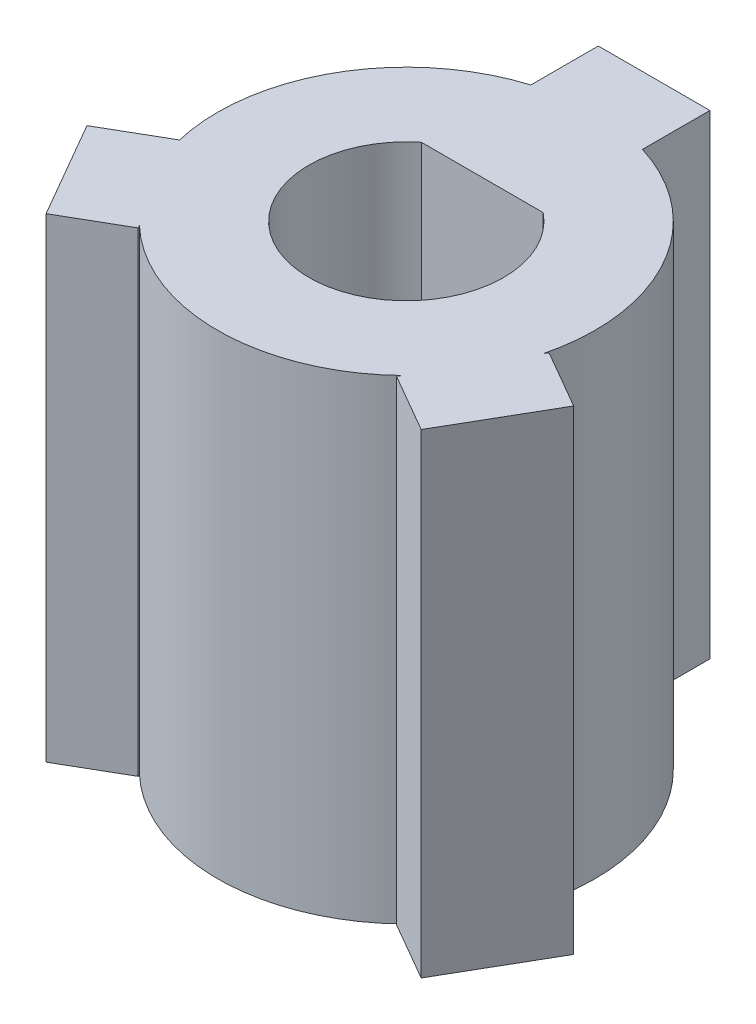
ISO-10303-21;
HEADER;
FILE_DESCRIPTION(('STEP AP214'),'2;1');
FILE_NAME('part.step','',(''),(''),'','','');
FILE_SCHEMA(('AUTOMOTIVE_DESIGN { 1 0 10303 214 1 1 1 1 }'));
ENDSEC;
DATA;
#1=APPLICATION_CONTEXT('core data for automotive mechanical design processes');
#2=APPLICATION_PROTOCOL_DEFINITION('international standard','automotive_design',2000,#1);
#3=PRODUCT_CONTEXT('',#1,'mechanical');
#4=PRODUCT('Part','Part','',(#3));
#5=PRODUCT_RELATED_PRODUCT_CATEGORY('part','',(#4));
#6=PRODUCT_DEFINITION_FORMATION('','',#4);
#7=PRODUCT_DEFINITION_CONTEXT('part definition',#1,'design');
#8=PRODUCT_DEFINITION('design','',#6,#7);
#9=PRODUCT_DEFINITION_SHAPE('','',#8);
#10=(LENGTH_UNIT() NAMED_UNIT(*) SI_UNIT(.MILLI.,.METRE.));
#11=(NAMED_UNIT(*) PLANE_ANGLE_UNIT() SI_UNIT($,.RADIAN.));
#12=(NAMED_UNIT(*) SI_UNIT($,.STERADIAN.) SOLID_ANGLE_UNIT());
#13=UNCERTAINTY_MEASURE_WITH_UNIT(LENGTH_MEASURE(1.E-05),#10,'distance_accuracy_value','');
#14=(GEOMETRIC_REPRESENTATION_CONTEXT(3) GLOBAL_UNCERTAINTY_ASSIGNED_CONTEXT((#13)) GLOBAL_UNIT_ASSIGNED_CONTEXT((#10,
#11,#12)) REPRESENTATION_CONTEXT('',''));
#15=CARTESIAN_POINT('',(0.,0.,0.));
#16=DIRECTION('',(0.,0.,1.));
#17=DIRECTION('',(1.,0.,0.));
#18=AXIS2_PLACEMENT_3D('',#15,#16,#17);
#19=CARTESIAN_POINT('',(0.,10.,0.));
#20=DIRECTION('',(0.,-1.,0.));
#21=DIRECTION('',(0.,0.,-1.));
#22=AXIS2_PLACEMENT_3D('',#19,#20,#21);
#23=CYLINDRICAL_SURFACE('',#22,3.975);
#24=CARTESIAN_POINT('',(0.,10.,0.));
#25=DIRECTION('',(0.,1.,0.));
#26=DIRECTION('',(0.,0.,1.));
#27=AXIS2_PLACEMENT_3D('',#24,#25,#26);
#28=CIRCLE('',#27,3.975);
#29=CARTESIAN_POINT('',(-2.73416765693012,10.,2.88529933001713));
#30=VERTEX_POINT('',#29);
#31=CARTESIAN_POINT('',(2.76816174994799,10.,2.85270144356624));
#32=VERTEX_POINT('',#31);
#33=EDGE_CURVE('E49',#30,#32,#28,.T.);
#34=ORIENTED_EDGE('',*,*,#33,.F.);
#35=DIRECTION('',(0.,-1.,0.));
#36=VECTOR('',#35,1.);
#37=CARTESIAN_POINT('',(-2.73416765693011,10.,2.88529933001713));
#38=LINE('',#37,#36);
#39=CARTESIAN_POINT('',(-2.73416765693012,0.,2.88529933001713));
#40=VERTEX_POINT('',#39);
#41=EDGE_CURVE('E229',#30,#40,#38,.T.);
#42=ORIENTED_EDGE('',*,*,#41,.T.);
#43=CARTESIAN_POINT('',(0.,0.,0.));
#44=DIRECTION('',(0.,1.,0.));
#45=DIRECTION('',(0.,0.,1.));
#46=AXIS2_PLACEMENT_3D('',#43,#44,#45);
#47=CIRCLE('',#46,3.975);
#48=CARTESIAN_POINT('',(2.76816174994799,0.,2.85270144356624));
#49=VERTEX_POINT('',#48);
#50=EDGE_CURVE('E376',#40,#49,#47,.T.);
#51=ORIENTED_EDGE('',*,*,#50,.T.);
#52=DIRECTION('',(0.,-1.,0.));
#53=VECTOR('',#52,1.);
#54=CARTESIAN_POINT('',(2.76816174994798,10.,2.85270144356624));
#55=LINE('',#54,#53);
#56=EDGE_CURVE('E267',#49,#32,#55,.F.);
#57=ORIENTED_EDGE('',*,*,#56,.T.);
#58=EDGE_LOOP('',(#34,#42,#51,#57));
#59=FACE_BOUND('',#58,.T.);
#60=ADVANCED_FACE('F39',(#59),#23,.T.);
#61=CARTESIAN_POINT('',(3.8545927945149,10.,0.970947675456227));
#62=VERTEX_POINT('',#61);
#63=CARTESIAN_POINT('',(1.175,10.,-3.79736750920951));
#64=VERTEX_POINT('',#63);
#65=EDGE_CURVE('E50',#62,#64,#28,.T.);
#66=ORIENTED_EDGE('',*,*,#65,.F.);
#67=DIRECTION('',(0.,-1.,0.));
#68=VECTOR('',#67,1.);
#69=CARTESIAN_POINT('',(3.8545927945149,10.,0.970947675456223));
#70=LINE('',#69,#68);
#71=CARTESIAN_POINT('',(3.8545927945149,0.,0.970947675456226));
#72=VERTEX_POINT('',#71);
#73=EDGE_CURVE('E280',#62,#72,#70,.T.);
#74=ORIENTED_EDGE('',*,*,#73,.T.);
#75=CARTESIAN_POINT('',(1.175,0.,-3.79736750920951));
#76=VERTEX_POINT('',#75);
#77=EDGE_CURVE('E339',#72,#76,#47,.T.);
#78=ORIENTED_EDGE('',*,*,#77,.T.);
#79=DIRECTION('',(0.,1.,0.));
#80=VECTOR('',#79,1.);
#81=CARTESIAN_POINT('',(1.175,0.,-3.79736750920951));
#82=LINE('',#81,#80);
#83=EDGE_CURVE('E314',#76,#64,#82,.T.);
#84=ORIENTED_EDGE('',*,*,#83,.T.);
#85=EDGE_LOOP('',(#66,#74,#78,#84));
#86=FACE_BOUND('',#85,.T.);
#87=ADVANCED_FACE('F361',(#86),#23,.T.);
#88=CARTESIAN_POINT('',(-1.175,0.,-3.79736750920951));
#89=VERTEX_POINT('',#88);
#90=CARTESIAN_POINT('',(-3.86582634578211,0.,0.925208984098694));
#91=VERTEX_POINT('',#90);
#92=EDGE_CURVE('E43',#89,#91,#47,.T.);
#93=ORIENTED_EDGE('',*,*,#92,.T.);
#94=DIRECTION('',(0.,-1.,0.));
#95=VECTOR('',#94,1.);
#96=CARTESIAN_POINT('',(-3.86582634578211,10.,0.925208984098691));
#97=LINE('',#96,#95);
#98=CARTESIAN_POINT('',(-3.86582634578211,10.,0.925208984098694));
#99=VERTEX_POINT('',#98);
#100=EDGE_CURVE('E174',#91,#99,#97,.F.);
#101=ORIENTED_EDGE('',*,*,#100,.T.);
#102=CARTESIAN_POINT('',(-1.175,10.,-3.79736750920951));
#103=VERTEX_POINT('',#102);
#104=EDGE_CURVE('E11',#103,#99,#28,.T.);
#105=ORIENTED_EDGE('',*,*,#104,.F.);
#106=DIRECTION('',(0.,1.,0.));
#107=VECTOR('',#106,1.);
#108=CARTESIAN_POINT('',(-1.175,0.,-3.79736750920951));
#109=LINE('',#108,#107);
#110=EDGE_CURVE('E297',#89,#103,#109,.T.);
#111=ORIENTED_EDGE('',*,*,#110,.F.);
#112=EDGE_LOOP('',(#93,#101,#105,#111));
#113=FACE_BOUND('',#112,.T.);
#114=ADVANCED_FACE('F41',(#113),#23,.T.);
#115=CARTESIAN_POINT('',(0.,10.,0.));
#116=DIRECTION('',(0.,1.,0.));
#117=DIRECTION('',(0.,0.,1.));
#118=AXIS2_PLACEMENT_3D('',#115,#116,#117);
#119=PLANE('',#118);
#120=ORIENTED_EDGE('',*,*,#104,.T.);
#121=DIRECTION('',(-0.5,0.,-0.866025403784438));
#122=VECTOR('',#121,1.);
#123=CARTESIAN_POINT('',(-2.70111673048088,10.,2.94254521386443));
#124=LINE('',#123,#122);
#125=CARTESIAN_POINT('',(-3.87611673048088,10.,0.907385514970996));
#126=VERTEX_POINT('',#125);
#127=EDGE_CURVE('E210',#99,#126,#124,.T.);
#128=ORIENTED_EDGE('',*,*,#127,.T.);
#129=DIRECTION('',(-0.866025403784438,0.,0.500000000000001));
#130=VECTOR('',#129,1.);
#131=CARTESIAN_POINT('',(-3.87611673048088,10.,0.907385514970996));
#132=LINE('',#131,#130);
#133=CARTESIAN_POINT('',(-5.10587280385478,10.,1.617385514971));
#134=VERTEX_POINT('',#133);
#135=EDGE_CURVE('E188',#126,#134,#132,.T.);
#136=ORIENTED_EDGE('',*,*,#135,.T.);
#137=DIRECTION('',(0.5,0.,0.866025403784438));
#138=VECTOR('',#137,1.);
#139=CARTESIAN_POINT('',(-5.10587280385478,10.,1.617385514971));
#140=LINE('',#139,#138);
#141=CARTESIAN_POINT('',(-3.93087280385478,10.,3.65254521386443));
#142=VERTEX_POINT('',#141);
#143=EDGE_CURVE('E213',#134,#142,#140,.T.);
#144=ORIENTED_EDGE('',*,*,#143,.T.);
#145=DIRECTION('',(0.866025403784439,0.,-0.5));
#146=VECTOR('',#145,1.);
#147=CARTESIAN_POINT('',(-3.93087280385478,10.,3.65254521386443));
#148=LINE('',#147,#146);
#149=CARTESIAN_POINT('',(-2.70111673048088,10.,2.94254521386443));
#150=VERTEX_POINT('',#149);
#151=EDGE_CURVE('E181',#142,#150,#148,.T.);
#152=ORIENTED_EDGE('',*,*,#151,.T.);
#153=EDGE_CURVE('E57',#150,#30,#124,.T.);
#154=ORIENTED_EDGE('',*,*,#153,.T.);
#155=ORIENTED_EDGE('',*,*,#33,.T.);
#156=DIRECTION('',(-0.5,0.,0.866025403784439));
#157=VECTOR('',#156,1.);
#158=CARTESIAN_POINT('',(3.89887727223154,10.,0.89424471006435));
#159=LINE('',#158,#157);
#160=CARTESIAN_POINT('',(2.72387727223154,10.,2.92940440895778));
#161=VERTEX_POINT('',#160);
#162=EDGE_CURVE('E233',#32,#161,#159,.T.);
#163=ORIENTED_EDGE('',*,*,#162,.T.);
#164=DIRECTION('',(0.866025403784439,0.,0.5));
#165=VECTOR('',#164,1.);
#166=CARTESIAN_POINT('',(2.72387727223154,10.,2.92940440895778));
#167=LINE('',#166,#165);
#168=CARTESIAN_POINT('',(3.95363334560544,10.,3.63940440895778));
#169=VERTEX_POINT('',#168);
#170=EDGE_CURVE('E253',#161,#169,#167,.T.);
#171=ORIENTED_EDGE('',*,*,#170,.T.);
#172=DIRECTION('',(0.499999999999999,0.,-0.866025403784439));
#173=VECTOR('',#172,1.);
#174=CARTESIAN_POINT('',(3.95363334560544,10.,3.63940440895778));
#175=LINE('',#174,#173);
#176=CARTESIAN_POINT('',(5.12863334560544,10.,1.60424471006435));
#177=VERTEX_POINT('',#176);
#178=EDGE_CURVE('E257',#169,#177,#175,.T.);
#179=ORIENTED_EDGE('',*,*,#178,.T.);
#180=DIRECTION('',(-0.866025403784439,0.,-0.5));
#181=VECTOR('',#180,1.);
#182=CARTESIAN_POINT('',(5.12863334560544,10.,1.60424471006435));
#183=LINE('',#182,#181);
#184=CARTESIAN_POINT('',(3.89887727223154,10.,0.89424471006435));
#185=VERTEX_POINT('',#184);
#186=EDGE_CURVE('E261',#177,#185,#183,.T.);
#187=ORIENTED_EDGE('',*,*,#186,.T.);
#188=EDGE_CURVE('E64',#185,#62,#159,.T.);
#189=ORIENTED_EDGE('',*,*,#188,.T.);
#190=ORIENTED_EDGE('',*,*,#65,.T.);
#191=DIRECTION('',(0.,0.,-1.));
#192=VECTOR('',#191,1.);
#193=CARTESIAN_POINT('',(1.175,10.,-3.79736750920951));
#194=LINE('',#193,#192);
#195=CARTESIAN_POINT('',(1.175,10.,-5.21736750920951));
#196=VERTEX_POINT('',#195);
#197=EDGE_CURVE('E300',#64,#196,#194,.T.);
#198=ORIENTED_EDGE('',*,*,#197,.T.);
#199=DIRECTION('',(-1.,0.,0.));
#200=VECTOR('',#199,1.);
#201=CARTESIAN_POINT('',(1.175,10.,-5.21736750920951));
#202=LINE('',#201,#200);
#203=CARTESIAN_POINT('',(-1.175,10.,-5.21736750920951));
#204=VERTEX_POINT('',#203);
#205=EDGE_CURVE('E289',#196,#204,#202,.T.);
#206=ORIENTED_EDGE('',*,*,#205,.T.);
#207=DIRECTION('',(0.,0.,1.));
#208=VECTOR('',#207,1.);
#209=CARTESIAN_POINT('',(-1.175,10.,-5.21736750920951));
#210=LINE('',#209,#208);
#211=EDGE_CURVE('E284',#204,#103,#210,.T.);
#212=ORIENTED_EDGE('',*,*,#211,.T.);
#213=EDGE_LOOP('',(#120,#128,#136,#144,#152,#154,#155,#163,#171,#179,#187,#189,#190,#198,#206,#212));
#214=FACE_BOUND('',#213,.T.);
#215=CARTESIAN_POINT('',(0.,10.,0.));
#216=DIRECTION('',(0.,1.,0.));
#217=DIRECTION('',(0.,0.,1.));
#218=AXIS2_PLACEMENT_3D('',#215,#216,#217);
#219=CIRCLE('',#218,2.05);
#220=CARTESIAN_POINT('',(-1.28160056179763,10.,-1.6));
#221=VERTEX_POINT('',#220);
#222=CARTESIAN_POINT('',(1.28160056179763,10.,-1.6));
#223=VERTEX_POINT('',#222);
#224=EDGE_CURVE('E310',#221,#223,#219,.T.);
#225=ORIENTED_EDGE('',*,*,#224,.F.);
#226=DIRECTION('',(-1.,0.,0.));
#227=VECTOR('',#226,1.);
#228=CARTESIAN_POINT('',(-1.28160056179763,10.,-1.6));
#229=LINE('',#228,#227);
#230=EDGE_CURVE('E326',#223,#221,#229,.T.);
#231=ORIENTED_EDGE('',*,*,#230,.F.);
#232=EDGE_LOOP('',(#225,#231));
#233=FACE_BOUND('',#232,.T.);
#234=ADVANCED_FACE('F350',(#214,#233),#119,.T.);
#235=CARTESIAN_POINT('',(0.,0.,0.));
#236=DIRECTION('',(0.,1.,0.));
#237=DIRECTION('',(0.,0.,1.));
#238=AXIS2_PLACEMENT_3D('',#235,#236,#237);
#239=PLANE('',#238);
#240=DIRECTION('',(-1.,0.,0.));
#241=VECTOR('',#240,1.);
#242=CARTESIAN_POINT('',(-1.28160056179763,0.,-1.6));
#243=LINE('',#242,#241);
#244=CARTESIAN_POINT('',(1.28160056179763,0.,-1.6));
#245=VERTEX_POINT('',#244);
#246=CARTESIAN_POINT('',(-1.28160056179763,0.,-1.6));
#247=VERTEX_POINT('',#246);
#248=EDGE_CURVE('E325',#245,#247,#243,.T.);
#249=ORIENTED_EDGE('',*,*,#248,.T.);
#250=CARTESIAN_POINT('',(0.,0.,0.));
#251=DIRECTION('',(0.,1.,0.));
#252=DIRECTION('',(0.,0.,1.));
#253=AXIS2_PLACEMENT_3D('',#250,#251,#252);
#254=CIRCLE('',#253,2.05);
#255=EDGE_CURVE('E321',#247,#245,#254,.T.);
#256=ORIENTED_EDGE('',*,*,#255,.T.);
#257=EDGE_LOOP('',(#249,#256));
#258=FACE_BOUND('',#257,.T.);
#259=ORIENTED_EDGE('',*,*,#50,.F.);
#260=DIRECTION('',(-0.5,0.,-0.866025403784438));
#261=VECTOR('',#260,1.);
#262=CARTESIAN_POINT('',(-2.70111673048088,0.,2.94254521386443));
#263=LINE('',#262,#261);
#264=CARTESIAN_POINT('',(-2.70111673048088,0.,2.94254521386443));
#265=VERTEX_POINT('',#264);
#266=EDGE_CURVE('E180',#265,#40,#263,.T.);
#267=ORIENTED_EDGE('',*,*,#266,.F.);
#268=DIRECTION('',(0.866025403784439,0.,-0.5));
#269=VECTOR('',#268,1.);
#270=CARTESIAN_POINT('',(-3.93087280385478,0.,3.65254521386443));
#271=LINE('',#270,#269);
#272=CARTESIAN_POINT('',(-3.93087280385478,0.,3.65254521386443));
#273=VERTEX_POINT('',#272);
#274=EDGE_CURVE('E191',#273,#265,#271,.T.);
#275=ORIENTED_EDGE('',*,*,#274,.F.);
#276=DIRECTION('',(0.5,0.,0.866025403784438));
#277=VECTOR('',#276,1.);
#278=CARTESIAN_POINT('',(-5.10587280385478,0.,1.617385514971));
#279=LINE('',#278,#277);
#280=CARTESIAN_POINT('',(-5.10587280385478,0.,1.617385514971));
#281=VERTEX_POINT('',#280);
#282=EDGE_CURVE('E198',#281,#273,#279,.T.);
#283=ORIENTED_EDGE('',*,*,#282,.F.);
#284=DIRECTION('',(-0.866025403784438,0.,0.500000000000001));
#285=VECTOR('',#284,1.);
#286=CARTESIAN_POINT('',(-3.87611673048088,0.,0.907385514970996));
#287=LINE('',#286,#285);
#288=CARTESIAN_POINT('',(-3.87611673048088,0.,0.907385514970996));
#289=VERTEX_POINT('',#288);
#290=EDGE_CURVE('E186',#289,#281,#287,.T.);
#291=ORIENTED_EDGE('',*,*,#290,.F.);
#292=EDGE_CURVE('E168',#91,#289,#263,.T.);
#293=ORIENTED_EDGE('',*,*,#292,.F.);
#294=ORIENTED_EDGE('',*,*,#92,.F.);
#295=DIRECTION('',(0.,0.,1.));
#296=VECTOR('',#295,1.);
#297=CARTESIAN_POINT('',(-1.175,0.,-5.21736750920951));
#298=LINE('',#297,#296);
#299=CARTESIAN_POINT('',(-1.175,0.,-5.21736750920951));
#300=VERTEX_POINT('',#299);
#301=EDGE_CURVE('E285',#300,#89,#298,.T.);
#302=ORIENTED_EDGE('',*,*,#301,.F.);
#303=DIRECTION('',(-1.,0.,0.));
#304=VECTOR('',#303,1.);
#305=CARTESIAN_POINT('',(1.175,0.,-5.21736750920951));
#306=LINE('',#305,#304);
#307=CARTESIAN_POINT('',(1.175,0.,-5.21736750920951));
#308=VERTEX_POINT('',#307);
#309=EDGE_CURVE('E293',#308,#300,#306,.T.);
#310=ORIENTED_EDGE('',*,*,#309,.F.);
#311=DIRECTION('',(0.,0.,-1.));
#312=VECTOR('',#311,1.);
#313=CARTESIAN_POINT('',(1.175,0.,-3.79736750920951));
#314=LINE('',#313,#312);
#315=EDGE_CURVE('E288',#76,#308,#314,.T.);
#316=ORIENTED_EDGE('',*,*,#315,.F.);
#317=ORIENTED_EDGE('',*,*,#77,.F.);
#318=DIRECTION('',(-0.5,0.,0.866025403784439));
#319=VECTOR('',#318,1.);
#320=CARTESIAN_POINT('',(3.89887727223154,0.,0.89424471006435));
#321=LINE('',#320,#319);
#322=CARTESIAN_POINT('',(3.89887727223154,0.,0.89424471006435));
#323=VERTEX_POINT('',#322);
#324=EDGE_CURVE('E234',#323,#72,#321,.T.);
#325=ORIENTED_EDGE('',*,*,#324,.F.);
#326=DIRECTION('',(-0.866025403784439,0.,-0.5));
#327=VECTOR('',#326,1.);
#328=CARTESIAN_POINT('',(5.12863334560544,0.,1.60424471006435));
#329=LINE('',#328,#327);
#330=CARTESIAN_POINT('',(5.12863334560544,0.,1.60424471006435));
#331=VERTEX_POINT('',#330);
#332=EDGE_CURVE('E246',#331,#323,#329,.T.);
#333=ORIENTED_EDGE('',*,*,#332,.F.);
#334=DIRECTION('',(0.499999999999999,0.,-0.866025403784439));
#335=VECTOR('',#334,1.);
#336=CARTESIAN_POINT('',(3.95363334560544,0.,3.63940440895778));
#337=LINE('',#336,#335);
#338=CARTESIAN_POINT('',(3.95363334560544,0.,3.63940440895778));
#339=VERTEX_POINT('',#338);
#340=EDGE_CURVE('E242',#339,#331,#337,.T.);
#341=ORIENTED_EDGE('',*,*,#340,.F.);
#342=DIRECTION('',(0.866025403784439,0.,0.5));
#343=VECTOR('',#342,1.);
#344=CARTESIAN_POINT('',(2.72387727223154,0.,2.92940440895778));
#345=LINE('',#344,#343);
#346=CARTESIAN_POINT('',(2.72387727223154,0.,2.92940440895778));
#347=VERTEX_POINT('',#346);
#348=EDGE_CURVE('E237',#347,#339,#345,.T.);
#349=ORIENTED_EDGE('',*,*,#348,.F.);
#350=EDGE_CURVE('E238',#49,#347,#321,.T.);
#351=ORIENTED_EDGE('',*,*,#350,.F.);
#352=EDGE_LOOP('',(#259,#267,#275,#283,#291,#293,#294,#302,#310,#316,#317,#325,#333,#341,#349,#351));
#353=FACE_BOUND('',#352,.T.);
#354=ADVANCED_FACE('F195',(#258,#353),#239,.F.);
#355=CARTESIAN_POINT('',(0.,0.,0.));
#356=DIRECTION('',(0.,1.,0.));
#357=DIRECTION('',(0.,0.,1.));
#358=AXIS2_PLACEMENT_3D('',#355,#356,#357);
#359=CYLINDRICAL_SURFACE('',#358,2.05);
#360=ORIENTED_EDGE('',*,*,#224,.T.);
#361=DIRECTION('',(0.,1.,0.));
#362=VECTOR('',#361,1.);
#363=CARTESIAN_POINT('',(1.28160056179763,0.,-1.6));
#364=LINE('',#363,#362);
#365=EDGE_CURVE('E330',#245,#223,#364,.T.);
#366=ORIENTED_EDGE('',*,*,#365,.F.);
#367=ORIENTED_EDGE('',*,*,#255,.F.);
#368=DIRECTION('',(0.,1.,0.));
#369=VECTOR('',#368,1.);
#370=CARTESIAN_POINT('',(-1.28160056179763,0.,-1.6));
#371=LINE('',#370,#369);
#372=EDGE_CURVE('E336',#247,#221,#371,.T.);
#373=ORIENTED_EDGE('',*,*,#372,.T.);
#374=EDGE_LOOP('',(#360,#366,#367,#373));
#375=FACE_BOUND('',#374,.T.);
#376=ADVANCED_FACE('F351',(#375),#359,.F.);
#377=CARTESIAN_POINT('',(-1.28160056179763,0.,-1.6));
#378=DIRECTION('',(0.,0.,-1.));
#379=DIRECTION('',(-1.,0.,0.));
#380=AXIS2_PLACEMENT_3D('',#377,#378,#379);
#381=PLANE('',#380);
#382=ORIENTED_EDGE('',*,*,#230,.T.);
#383=ORIENTED_EDGE('',*,*,#372,.F.);
#384=ORIENTED_EDGE('',*,*,#248,.F.);
#385=ORIENTED_EDGE('',*,*,#365,.T.);
#386=EDGE_LOOP('',(#382,#383,#384,#385));
#387=FACE_BOUND('',#386,.T.);
#388=ADVANCED_FACE('F345',(#387),#381,.F.);
#389=CARTESIAN_POINT('',(-1.175,0.,-5.21736750920951));
#390=DIRECTION('',(-1.,0.,0.));
#391=DIRECTION('',(0.,0.,1.));
#392=AXIS2_PLACEMENT_3D('',#389,#390,#391);
#393=PLANE('',#392);
#394=ORIENTED_EDGE('',*,*,#211,.F.);
#395=DIRECTION('',(0.,1.,0.));
#396=VECTOR('',#395,1.);
#397=CARTESIAN_POINT('',(-1.175,0.,-5.21736750920951));
#398=LINE('',#397,#396);
#399=EDGE_CURVE('E307',#300,#204,#398,.T.);
#400=ORIENTED_EDGE('',*,*,#399,.F.);
#401=ORIENTED_EDGE('',*,*,#301,.T.);
#402=ORIENTED_EDGE('',*,*,#110,.T.);
#403=EDGE_LOOP('',(#394,#400,#401,#402));
#404=FACE_BOUND('',#403,.T.);
#405=ADVANCED_FACE('F394',(#404),#393,.T.);
#406=CARTESIAN_POINT('',(1.175,0.,-5.21736750920951));
#407=DIRECTION('',(0.,0.,-1.));
#408=DIRECTION('',(-1.,0.,0.));
#409=AXIS2_PLACEMENT_3D('',#406,#407,#408);
#410=PLANE('',#409);
#411=ORIENTED_EDGE('',*,*,#205,.F.);
#412=DIRECTION('',(0.,1.,0.));
#413=VECTOR('',#412,1.);
#414=CARTESIAN_POINT('',(1.175,0.,-5.21736750920951));
#415=LINE('',#414,#413);
#416=EDGE_CURVE('E311',#308,#196,#415,.T.);
#417=ORIENTED_EDGE('',*,*,#416,.F.);
#418=ORIENTED_EDGE('',*,*,#309,.T.);
#419=ORIENTED_EDGE('',*,*,#399,.T.);
#420=EDGE_LOOP('',(#411,#417,#418,#419));
#421=FACE_BOUND('',#420,.T.);
#422=ADVANCED_FACE('F391',(#421),#410,.T.);
#423=CARTESIAN_POINT('',(1.175,0.,-3.79736750920951));
#424=DIRECTION('',(1.,0.,0.));
#425=DIRECTION('',(0.,0.,-1.));
#426=AXIS2_PLACEMENT_3D('',#423,#424,#425);
#427=PLANE('',#426);
#428=ORIENTED_EDGE('',*,*,#197,.F.);
#429=ORIENTED_EDGE('',*,*,#83,.F.);
#430=ORIENTED_EDGE('',*,*,#315,.T.);
#431=ORIENTED_EDGE('',*,*,#416,.T.);
#432=EDGE_LOOP('',(#428,#429,#430,#431));
#433=FACE_BOUND('',#432,.T.);
#434=ADVANCED_FACE('F387',(#433),#427,.T.);
#435=CARTESIAN_POINT('',(3.89887727223154,0.,0.89424471006435));
#436=DIRECTION('',(-0.866025403784438,0.,-0.5));
#437=DIRECTION('',(-0.5,0.,0.866025403784439));
#438=AXIS2_PLACEMENT_3D('',#435,#436,#437);
#439=PLANE('',#438);
#440=ORIENTED_EDGE('',*,*,#73,.F.);
#441=ORIENTED_EDGE('',*,*,#188,.F.);
#442=DIRECTION('',(0.,1.,0.));
#443=VECTOR('',#442,1.);
#444=CARTESIAN_POINT('',(3.89887727223154,0.,0.89424471006435));
#445=LINE('',#444,#443);
#446=EDGE_CURVE('E264',#323,#185,#445,.T.);
#447=ORIENTED_EDGE('',*,*,#446,.F.);
#448=ORIENTED_EDGE('',*,*,#324,.T.);
#449=EDGE_LOOP('',(#440,#441,#447,#448));
#450=FACE_BOUND('',#449,.T.);
#451=ADVANCED_FACE('F405',(#450),#439,.T.);
#452=ORIENTED_EDGE('',*,*,#56,.F.);
#453=ORIENTED_EDGE('',*,*,#350,.T.);
#454=DIRECTION('',(0.,1.,0.));
#455=VECTOR('',#454,1.);
#456=CARTESIAN_POINT('',(2.72387727223154,0.,2.92940440895778));
#457=LINE('',#456,#455);
#458=EDGE_CURVE('E250',#347,#161,#457,.T.);
#459=ORIENTED_EDGE('',*,*,#458,.T.);
#460=ORIENTED_EDGE('',*,*,#162,.F.);
#461=EDGE_LOOP('',(#452,#453,#459,#460));
#462=FACE_BOUND('',#461,.T.);
#463=ADVANCED_FACE('F409',(#462),#439,.T.);
#464=CARTESIAN_POINT('',(5.12863334560544,0.,1.60424471006435));
#465=DIRECTION('',(0.5,0.,-0.866025403784439));
#466=DIRECTION('',(-0.866025403784439,0.,-0.5));
#467=AXIS2_PLACEMENT_3D('',#464,#465,#466);
#468=PLANE('',#467);
#469=ORIENTED_EDGE('',*,*,#186,.F.);
#470=DIRECTION('',(0.,1.,0.));
#471=VECTOR('',#470,1.);
#472=CARTESIAN_POINT('',(5.12863334560544,0.,1.60424471006435));
#473=LINE('',#472,#471);
#474=EDGE_CURVE('E268',#331,#177,#473,.T.);
#475=ORIENTED_EDGE('',*,*,#474,.F.);
#476=ORIENTED_EDGE('',*,*,#332,.T.);
#477=ORIENTED_EDGE('',*,*,#446,.T.);
#478=EDGE_LOOP('',(#469,#475,#476,#477));
#479=FACE_BOUND('',#478,.T.);
#480=ADVANCED_FACE('F419',(#479),#468,.T.);
#481=CARTESIAN_POINT('',(3.95363334560544,0.,3.63940440895778));
#482=DIRECTION('',(0.866025403784439,0.,0.5));
#483=DIRECTION('',(0.5,0.,-0.866025403784439));
#484=AXIS2_PLACEMENT_3D('',#481,#482,#483);
#485=PLANE('',#484);
#486=ORIENTED_EDGE('',*,*,#178,.F.);
#487=DIRECTION('',(0.,1.,0.));
#488=VECTOR('',#487,1.);
#489=CARTESIAN_POINT('',(3.95363334560544,0.,3.63940440895778));
#490=LINE('',#489,#488);
#491=EDGE_CURVE('E271',#339,#169,#490,.T.);
#492=ORIENTED_EDGE('',*,*,#491,.F.);
#493=ORIENTED_EDGE('',*,*,#340,.T.);
#494=ORIENTED_EDGE('',*,*,#474,.T.);
#495=EDGE_LOOP('',(#486,#492,#493,#494));
#496=FACE_BOUND('',#495,.T.);
#497=ADVANCED_FACE('F415',(#496),#485,.T.);
#498=CARTESIAN_POINT('',(2.72387727223154,0.,2.92940440895778));
#499=DIRECTION('',(-0.5,0.,0.866025403784439));
#500=DIRECTION('',(0.866025403784439,0.,0.5));
#501=AXIS2_PLACEMENT_3D('',#498,#499,#500);
#502=PLANE('',#501);
#503=ORIENTED_EDGE('',*,*,#170,.F.);
#504=ORIENTED_EDGE('',*,*,#458,.F.);
#505=ORIENTED_EDGE('',*,*,#348,.T.);
#506=ORIENTED_EDGE('',*,*,#491,.T.);
#507=EDGE_LOOP('',(#503,#504,#505,#506));
#508=FACE_BOUND('',#507,.T.);
#509=ADVANCED_FACE('F411',(#508),#502,.T.);
#510=CARTESIAN_POINT('',(-2.70111673048088,0.,2.94254521386443));
#511=DIRECTION('',(0.866025403784438,0.,-0.5));
#512=DIRECTION('',(-0.5,0.,-0.866025403784439));
#513=AXIS2_PLACEMENT_3D('',#510,#511,#512);
#514=PLANE('',#513);
#515=ORIENTED_EDGE('',*,*,#41,.F.);
#516=ORIENTED_EDGE('',*,*,#153,.F.);
#517=DIRECTION('',(0.,1.,0.));
#518=VECTOR('',#517,1.);
#519=CARTESIAN_POINT('',(-2.70111673048088,0.,2.94254521386443));
#520=LINE('',#519,#518);
#521=EDGE_CURVE('E219',#265,#150,#520,.T.);
#522=ORIENTED_EDGE('',*,*,#521,.F.);
#523=ORIENTED_EDGE('',*,*,#266,.T.);
#524=EDGE_LOOP('',(#515,#516,#522,#523));
#525=FACE_BOUND('',#524,.T.);
#526=ADVANCED_FACE('F414',(#525),#514,.T.);
#527=ORIENTED_EDGE('',*,*,#100,.F.);
#528=ORIENTED_EDGE('',*,*,#292,.T.);
#529=DIRECTION('',(0.,1.,0.));
#530=VECTOR('',#529,1.);
#531=CARTESIAN_POINT('',(-3.87611673048088,0.,0.907385514970996));
#532=LINE('',#531,#530);
#533=EDGE_CURVE('E171',#289,#126,#532,.T.);
#534=ORIENTED_EDGE('',*,*,#533,.T.);
#535=ORIENTED_EDGE('',*,*,#127,.F.);
#536=EDGE_LOOP('',(#527,#528,#534,#535));
#537=FACE_BOUND('',#536,.T.);
#538=ADVANCED_FACE('F170',(#537),#514,.T.);
#539=CARTESIAN_POINT('',(-3.93087280385478,0.,3.65254521386443));
#540=DIRECTION('',(0.5,0.,0.866025403784438));
#541=DIRECTION('',(0.866025403784438,0.,-0.5));
#542=AXIS2_PLACEMENT_3D('',#539,#540,#541);
#543=PLANE('',#542);
#544=ORIENTED_EDGE('',*,*,#151,.F.);
#545=DIRECTION('',(0.,1.,0.));
#546=VECTOR('',#545,1.);
#547=CARTESIAN_POINT('',(-3.93087280385478,0.,3.65254521386443));
#548=LINE('',#547,#546);
#549=EDGE_CURVE('E222',#273,#142,#548,.T.);
#550=ORIENTED_EDGE('',*,*,#549,.F.);
#551=ORIENTED_EDGE('',*,*,#274,.T.);
#552=ORIENTED_EDGE('',*,*,#521,.T.);
#553=EDGE_LOOP('',(#544,#550,#551,#552));
#554=FACE_BOUND('',#553,.T.);
#555=ADVANCED_FACE('F432',(#554),#543,.T.);
#556=CARTESIAN_POINT('',(-5.10587280385478,0.,1.617385514971));
#557=DIRECTION('',(-0.866025403784438,0.,0.5));
#558=DIRECTION('',(0.5,0.,0.866025403784438));
#559=AXIS2_PLACEMENT_3D('',#556,#557,#558);
#560=PLANE('',#559);
#561=ORIENTED_EDGE('',*,*,#143,.F.);
#562=DIRECTION('',(0.,1.,0.));
#563=VECTOR('',#562,1.);
#564=CARTESIAN_POINT('',(-5.10587280385478,0.,1.617385514971));
#565=LINE('',#564,#563);
#566=EDGE_CURVE('E190',#281,#134,#565,.T.);
#567=ORIENTED_EDGE('',*,*,#566,.F.);
#568=ORIENTED_EDGE('',*,*,#282,.T.);
#569=ORIENTED_EDGE('',*,*,#549,.T.);
#570=EDGE_LOOP('',(#561,#567,#568,#569));
#571=FACE_BOUND('',#570,.T.);
#572=ADVANCED_FACE('F429',(#571),#560,.T.);
#573=CARTESIAN_POINT('',(-3.87611673048088,0.,0.907385514970996));
#574=DIRECTION('',(-0.500000000000001,0.,-0.866025403784438));
#575=DIRECTION('',(-0.866025403784438,0.,0.500000000000001));
#576=AXIS2_PLACEMENT_3D('',#573,#574,#575);
#577=PLANE('',#576);
#578=ORIENTED_EDGE('',*,*,#135,.F.);
#579=ORIENTED_EDGE('',*,*,#533,.F.);
#580=ORIENTED_EDGE('',*,*,#290,.T.);
#581=ORIENTED_EDGE('',*,*,#566,.T.);
#582=EDGE_LOOP('',(#578,#579,#580,#581));
#583=FACE_BOUND('',#582,.T.);
#584=ADVANCED_FACE('F185',(#583),#577,.T.);
#585=CLOSED_SHELL('',(#60,#87,#114,#234,#354,#376,#388,#405,#422,#434,#451,#463,#480,#497,#509,
#526,#538,#555,#572,#584));
#586=MANIFOLD_SOLID_BREP('B2',#585);
#587=ADVANCED_BREP_SHAPE_REPRESENTATION('',(#18,#586),#14);
#588=SHAPE_DEFINITION_REPRESENTATION(#9,#587);
ENDSEC;
END-ISO-10303-21;
